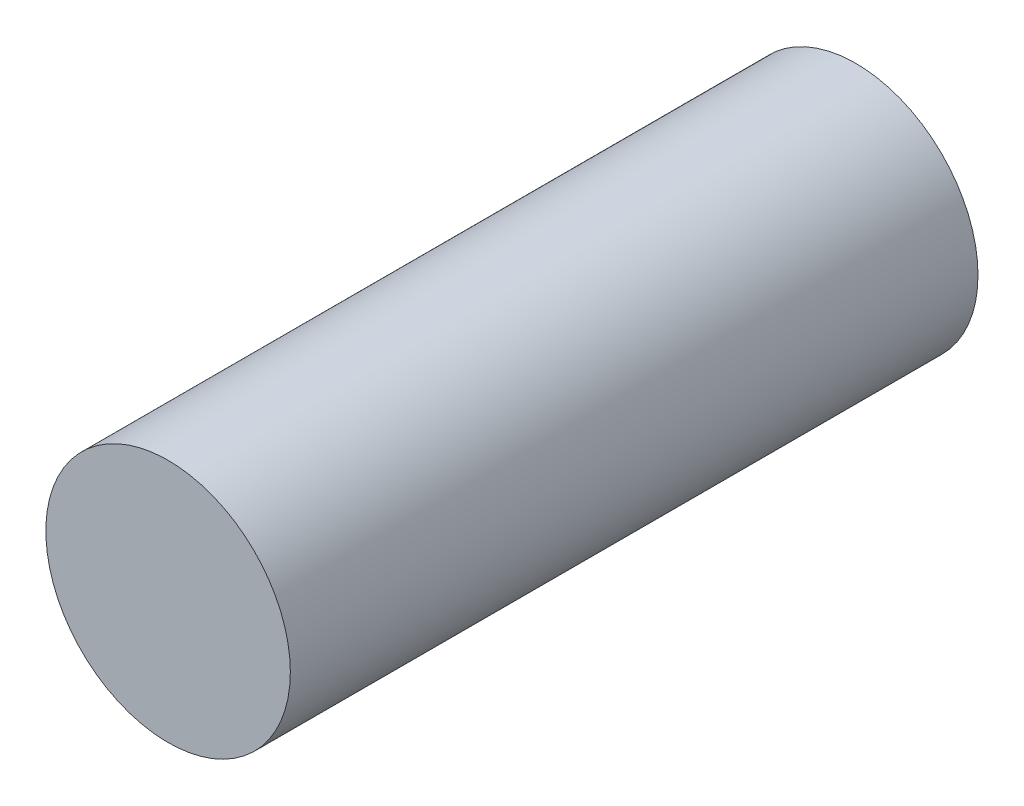
ISO-10303-21;
HEADER;
FILE_DESCRIPTION(('STEP AP214'),'2;1');
FILE_NAME('part.step','',(''),(''),'','','');
FILE_SCHEMA(('AUTOMOTIVE_DESIGN { 1 0 10303 214 1 1 1 1 }'));
ENDSEC;
DATA;
#1=APPLICATION_CONTEXT('core data for automotive mechanical design processes');
#2=APPLICATION_PROTOCOL_DEFINITION('international standard','automotive_design',2000,#1);
#3=PRODUCT_CONTEXT('',#1,'mechanical');
#4=PRODUCT('Part','Part','',(#3));
#5=PRODUCT_RELATED_PRODUCT_CATEGORY('part','',(#4));
#6=PRODUCT_DEFINITION_FORMATION('','',#4);
#7=PRODUCT_DEFINITION_CONTEXT('part definition',#1,'design');
#8=PRODUCT_DEFINITION('design','',#6,#7);
#9=PRODUCT_DEFINITION_SHAPE('','',#8);
#10=(LENGTH_UNIT() NAMED_UNIT(*) SI_UNIT(.MILLI.,.METRE.));
#11=(NAMED_UNIT(*) PLANE_ANGLE_UNIT() SI_UNIT($,.RADIAN.));
#12=(NAMED_UNIT(*) SI_UNIT($,.STERADIAN.) SOLID_ANGLE_UNIT());
#13=UNCERTAINTY_MEASURE_WITH_UNIT(LENGTH_MEASURE(1.E-05),#10,'distance_accuracy_value','');
#14=(GEOMETRIC_REPRESENTATION_CONTEXT(3) GLOBAL_UNCERTAINTY_ASSIGNED_CONTEXT((#13)) GLOBAL_UNIT_ASSIGNED_CONTEXT((#10,
#11,#12)) REPRESENTATION_CONTEXT('',''));
#15=CARTESIAN_POINT('',(0.,0.,0.));
#16=DIRECTION('',(0.,0.,1.));
#17=DIRECTION('',(1.,0.,0.));
#18=AXIS2_PLACEMENT_3D('',#15,#16,#17);
#19=CARTESIAN_POINT('',(0.,0.,450.));
#20=DIRECTION('',(0.,0.,-1.));
#21=DIRECTION('',(-1.,0.,0.));
#22=AXIS2_PLACEMENT_3D('',#19,#20,#21);
#23=CYLINDRICAL_SURFACE('',#22,80.);
#24=CARTESIAN_POINT('',(0.,0.,450.));
#25=DIRECTION('',(0.,0.,1.));
#26=DIRECTION('',(1.,0.,0.));
#27=AXIS2_PLACEMENT_3D('',#24,#25,#26);
#28=CIRCLE('',#27,80.);
#29=CARTESIAN_POINT('',(80.,0.,450.));
#30=VERTEX_POINT('',#29);
#31=EDGE_CURVE('E10',#30,#30,#28,.T.);
#32=ORIENTED_EDGE('',*,*,#31,.F.);
#33=EDGE_LOOP('',(#32));
#34=FACE_BOUND('',#33,.T.);
#35=CARTESIAN_POINT('',(0.,0.,0.));
#36=DIRECTION('',(0.,0.,1.));
#37=DIRECTION('',(1.,0.,0.));
#38=AXIS2_PLACEMENT_3D('',#35,#36,#37);
#39=CIRCLE('',#38,80.);
#40=CARTESIAN_POINT('',(80.,0.,0.));
#41=VERTEX_POINT('',#40);
#42=EDGE_CURVE('E44',#41,#41,#39,.T.);
#43=ORIENTED_EDGE('',*,*,#42,.T.);
#44=EDGE_LOOP('',(#43));
#45=FACE_BOUND('',#44,.T.);
#46=ADVANCED_FACE('F41',(#34,#45),#23,.T.);
#47=CARTESIAN_POINT('',(0.,0.,450.));
#48=DIRECTION('',(0.,0.,1.));
#49=DIRECTION('',(1.,0.,0.));
#50=AXIS2_PLACEMENT_3D('',#47,#48,#49);
#51=PLANE('',#50);
#52=ORIENTED_EDGE('',*,*,#31,.T.);
#53=EDGE_LOOP('',(#52));
#54=FACE_BOUND('',#53,.T.);
#55=ADVANCED_FACE('F56',(#54),#51,.T.);
#56=CARTESIAN_POINT('',(0.,0.,0.));
#57=DIRECTION('',(0.,0.,1.));
#58=DIRECTION('',(1.,0.,0.));
#59=AXIS2_PLACEMENT_3D('',#56,#57,#58);
#60=PLANE('',#59);
#61=ORIENTED_EDGE('',*,*,#42,.F.);
#62=EDGE_LOOP('',(#61));
#63=FACE_BOUND('',#62,.T.);
#64=ADVANCED_FACE('F54',(#63),#60,.F.);
#65=CLOSED_SHELL('',(#46,#55,#64));
#66=MANIFOLD_SOLID_BREP('B2',#65);
#67=ADVANCED_BREP_SHAPE_REPRESENTATION('',(#18,#66),#14);
#68=SHAPE_DEFINITION_REPRESENTATION(#9,#67);
ENDSEC;
END-ISO-10303-21;
